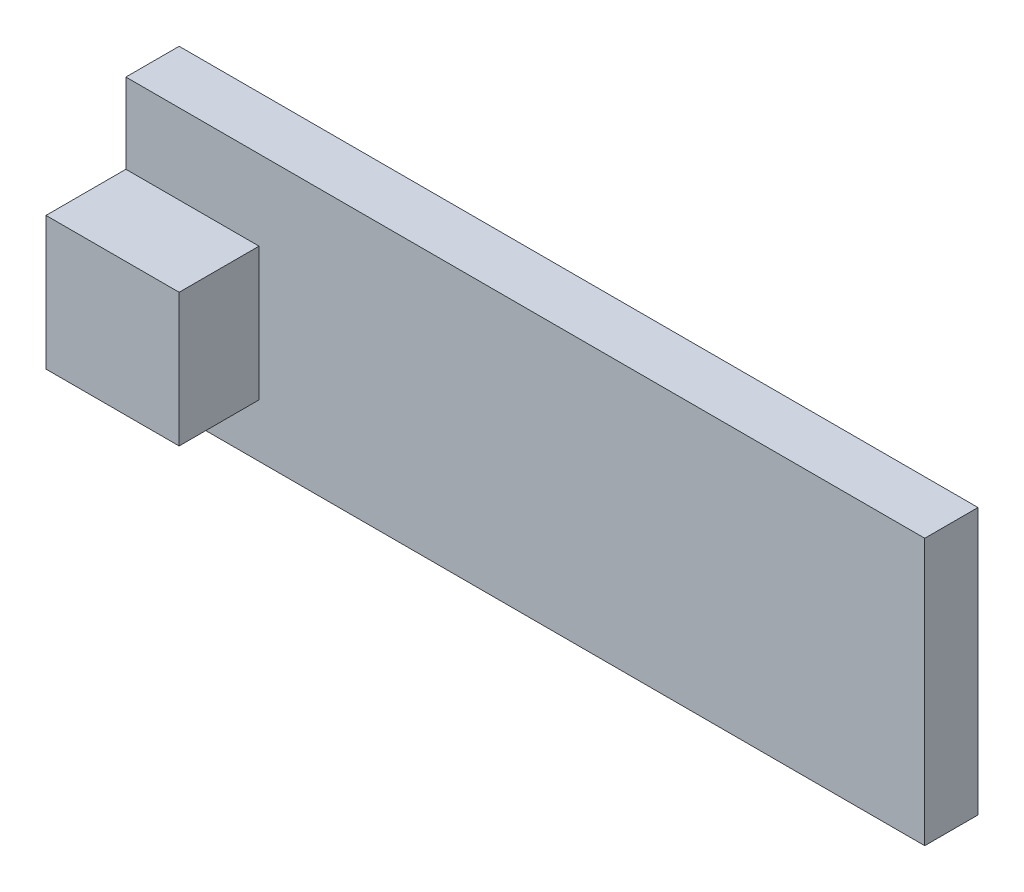
ISO-10303-21;
HEADER;
FILE_DESCRIPTION(('STEP AP214'),'2;1');
FILE_NAME('part.step','',(''),(''),'','','');
FILE_SCHEMA(('AUTOMOTIVE_DESIGN { 1 0 10303 214 1 1 1 1 }'));
ENDSEC;
DATA;
#1=APPLICATION_CONTEXT('core data for automotive mechanical design processes');
#2=APPLICATION_PROTOCOL_DEFINITION('international standard','automotive_design',2000,#1);
#3=PRODUCT_CONTEXT('',#1,'mechanical');
#4=PRODUCT('Part','Part','',(#3));
#5=PRODUCT_RELATED_PRODUCT_CATEGORY('part','',(#4));
#6=PRODUCT_DEFINITION_FORMATION('','',#4);
#7=PRODUCT_DEFINITION_CONTEXT('part definition',#1,'design');
#8=PRODUCT_DEFINITION('design','',#6,#7);
#9=PRODUCT_DEFINITION_SHAPE('','',#8);
#10=(LENGTH_UNIT() NAMED_UNIT(*) SI_UNIT(.MILLI.,.METRE.));
#11=(NAMED_UNIT(*) PLANE_ANGLE_UNIT() SI_UNIT($,.RADIAN.));
#12=(NAMED_UNIT(*) SI_UNIT($,.STERADIAN.) SOLID_ANGLE_UNIT());
#13=UNCERTAINTY_MEASURE_WITH_UNIT(LENGTH_MEASURE(1.E-05),#10,'distance_accuracy_value','');
#14=(GEOMETRIC_REPRESENTATION_CONTEXT(3) GLOBAL_UNCERTAINTY_ASSIGNED_CONTEXT((#13)) GLOBAL_UNIT_ASSIGNED_CONTEXT((#10,
#11,#12)) REPRESENTATION_CONTEXT('',''));
#15=CARTESIAN_POINT('',(0.,0.,0.));
#16=DIRECTION('',(0.,0.,1.));
#17=DIRECTION('',(1.,0.,0.));
#18=AXIS2_PLACEMENT_3D('',#15,#16,#17);
#19=CARTESIAN_POINT('',(4.99999999999999,7.,5.));
#20=DIRECTION('',(-1.,0.,0.));
#21=DIRECTION('',(0.,-1.,0.));
#22=AXIS2_PLACEMENT_3D('',#19,#20,#21);
#23=PLANE('',#22);
#24=DIRECTION('',(0.,1.,0.));
#25=VECTOR('',#24,1.);
#26=CARTESIAN_POINT('',(4.99999999999999,7.,2.));
#27=LINE('',#26,#25);
#28=CARTESIAN_POINT('',(4.99999999999999,2.,2.));
#29=VERTEX_POINT('',#28);
#30=CARTESIAN_POINT('',(4.99999999999999,7.,2.));
#31=VERTEX_POINT('',#30);
#32=EDGE_CURVE('E110',#29,#31,#27,.T.);
#33=ORIENTED_EDGE('',*,*,#32,.T.);
#34=DIRECTION('',(0.,0.,-1.));
#35=VECTOR('',#34,1.);
#36=CARTESIAN_POINT('',(4.99999999999999,7.,5.));
#37=LINE('',#36,#35);
#38=CARTESIAN_POINT('',(4.99999999999999,7.,5.));
#39=VERTEX_POINT('',#38);
#40=EDGE_CURVE('E12',#39,#31,#37,.T.);
#41=ORIENTED_EDGE('',*,*,#40,.F.);
#42=DIRECTION('',(0.,1.,0.));
#43=VECTOR('',#42,1.);
#44=CARTESIAN_POINT('',(4.99999999999999,7.,5.));
#45=LINE('',#44,#43);
#46=CARTESIAN_POINT('',(4.99999999999999,2.,5.));
#47=VERTEX_POINT('',#46);
#48=EDGE_CURVE('E98',#47,#39,#45,.T.);
#49=ORIENTED_EDGE('',*,*,#48,.F.);
#50=DIRECTION('',(0.,0.,-1.));
#51=VECTOR('',#50,1.);
#52=CARTESIAN_POINT('',(4.99999999999999,2.,5.));
#53=LINE('',#52,#51);
#54=EDGE_CURVE('E106',#47,#29,#53,.T.);
#55=ORIENTED_EDGE('',*,*,#54,.T.);
#56=EDGE_LOOP('',(#33,#41,#49,#55));
#57=FACE_BOUND('',#56,.T.);
#58=ADVANCED_FACE('F47',(#57),#23,.F.);
#59=CARTESIAN_POINT('',(4.99999999999999,7.,5.));
#60=DIRECTION('',(0.,-1.,0.));
#61=DIRECTION('',(1.,0.,0.));
#62=AXIS2_PLACEMENT_3D('',#59,#60,#61);
#63=PLANE('',#62);
#64=DIRECTION('',(-1.,0.,0.));
#65=VECTOR('',#64,1.);
#66=CARTESIAN_POINT('',(4.99999999999999,7.,2.));
#67=LINE('',#66,#65);
#68=CARTESIAN_POINT('',(0.,7.,2.));
#69=VERTEX_POINT('',#68);
#70=EDGE_CURVE('E102',#31,#69,#67,.T.);
#71=ORIENTED_EDGE('',*,*,#70,.T.);
#72=DIRECTION('',(0.,0.,-1.));
#73=VECTOR('',#72,1.);
#74=CARTESIAN_POINT('',(0.,7.,5.));
#75=LINE('',#74,#73);
#76=CARTESIAN_POINT('',(0.,7.,5.));
#77=VERTEX_POINT('',#76);
#78=EDGE_CURVE('E55',#77,#69,#75,.T.);
#79=ORIENTED_EDGE('',*,*,#78,.F.);
#80=DIRECTION('',(-1.,0.,0.));
#81=VECTOR('',#80,1.);
#82=CARTESIAN_POINT('',(4.99999999999999,7.,5.));
#83=LINE('',#82,#81);
#84=EDGE_CURVE('E93',#39,#77,#83,.T.);
#85=ORIENTED_EDGE('',*,*,#84,.F.);
#86=ORIENTED_EDGE('',*,*,#40,.T.);
#87=EDGE_LOOP('',(#71,#79,#85,#86));
#88=FACE_BOUND('',#87,.T.);
#89=ADVANCED_FACE('F101',(#88),#63,.F.);
#90=CARTESIAN_POINT('',(0.,7.,5.));
#91=DIRECTION('',(1.,0.,0.));
#92=DIRECTION('',(0.,1.,0.));
#93=AXIS2_PLACEMENT_3D('',#90,#91,#92);
#94=PLANE('',#93);
#95=DIRECTION('',(0.,-1.,0.));
#96=VECTOR('',#95,1.);
#97=CARTESIAN_POINT('',(0.,7.,2.));
#98=LINE('',#97,#96);
#99=CARTESIAN_POINT('',(0.,2.,2.));
#100=VERTEX_POINT('',#99);
#101=EDGE_CURVE('E80',#69,#100,#98,.T.);
#102=ORIENTED_EDGE('',*,*,#101,.T.);
#103=DIRECTION('',(0.,0.,-1.));
#104=VECTOR('',#103,1.);
#105=CARTESIAN_POINT('',(0.,2.,5.));
#106=LINE('',#105,#104);
#107=CARTESIAN_POINT('',(0.,2.,5.));
#108=VERTEX_POINT('',#107);
#109=EDGE_CURVE('E103',#108,#100,#106,.T.);
#110=ORIENTED_EDGE('',*,*,#109,.F.);
#111=DIRECTION('',(0.,-1.,0.));
#112=VECTOR('',#111,1.);
#113=CARTESIAN_POINT('',(0.,7.,5.));
#114=LINE('',#113,#112);
#115=EDGE_CURVE('E96',#77,#108,#114,.T.);
#116=ORIENTED_EDGE('',*,*,#115,.F.);
#117=ORIENTED_EDGE('',*,*,#78,.T.);
#118=EDGE_LOOP('',(#102,#110,#116,#117));
#119=FACE_BOUND('',#118,.T.);
#120=ADVANCED_FACE('F104',(#119),#94,.F.);
#121=CARTESIAN_POINT('',(4.99999999999999,2.,5.));
#122=DIRECTION('',(0.,1.,0.));
#123=DIRECTION('',(-1.,0.,0.));
#124=AXIS2_PLACEMENT_3D('',#121,#122,#123);
#125=PLANE('',#124);
#126=DIRECTION('',(1.,0.,0.));
#127=VECTOR('',#126,1.);
#128=CARTESIAN_POINT('',(4.99999999999999,2.,2.));
#129=LINE('',#128,#127);
#130=EDGE_CURVE('E86',#100,#29,#129,.T.);
#131=ORIENTED_EDGE('',*,*,#130,.T.);
#132=ORIENTED_EDGE('',*,*,#54,.F.);
#133=DIRECTION('',(1.,0.,0.));
#134=VECTOR('',#133,1.);
#135=CARTESIAN_POINT('',(4.99999999999999,2.,5.));
#136=LINE('',#135,#134);
#137=EDGE_CURVE('E63',#108,#47,#136,.T.);
#138=ORIENTED_EDGE('',*,*,#137,.F.);
#139=ORIENTED_EDGE('',*,*,#109,.T.);
#140=EDGE_LOOP('',(#131,#132,#138,#139));
#141=FACE_BOUND('',#140,.T.);
#142=ADVANCED_FACE('F117',(#141),#125,.F.);
#143=CARTESIAN_POINT('',(0.,0.,5.));
#144=DIRECTION('',(0.,0.,-1.));
#145=DIRECTION('',(-1.,0.,0.));
#146=AXIS2_PLACEMENT_3D('',#143,#144,#145);
#147=PLANE('',#146);
#148=ORIENTED_EDGE('',*,*,#48,.T.);
#149=ORIENTED_EDGE('',*,*,#84,.T.);
#150=ORIENTED_EDGE('',*,*,#115,.T.);
#151=ORIENTED_EDGE('',*,*,#137,.T.);
#152=EDGE_LOOP('',(#148,#149,#150,#151));
#153=FACE_BOUND('',#152,.T.);
#154=ADVANCED_FACE('F94',(#153),#147,.F.);
#155=CARTESIAN_POINT('',(0.,0.,2.));
#156=DIRECTION('',(0.,0.,-1.));
#157=DIRECTION('',(-1.,0.,0.));
#158=AXIS2_PLACEMENT_3D('',#155,#156,#157);
#159=PLANE('',#158);
#160=ORIENTED_EDGE('',*,*,#32,.F.);
#161=ORIENTED_EDGE('',*,*,#130,.F.);
#162=ORIENTED_EDGE('',*,*,#101,.F.);
#163=ORIENTED_EDGE('',*,*,#70,.F.);
#164=EDGE_LOOP('',(#160,#161,#162,#163));
#165=FACE_BOUND('',#164,.T.);
#166=ADVANCED_FACE('F120',(#165),#159,.T.);
#167=CLOSED_SHELL('',(#58,#89,#120,#142,#154,#166));
#168=MANIFOLD_SOLID_BREP('B2',#167);
#169=CARTESIAN_POINT('',(0.,0.,2.));
#170=DIRECTION('',(1.,0.,0.));
#171=DIRECTION('',(0.,1.,0.));
#172=AXIS2_PLACEMENT_3D('',#169,#170,#171);
#173=PLANE('',#172);
#174=DIRECTION('',(0.,-1.,0.));
#175=VECTOR('',#174,1.);
#176=CARTESIAN_POINT('',(0.,0.,0.));
#177=LINE('',#176,#175);
#178=CARTESIAN_POINT('',(0.,10.,0.));
#179=VERTEX_POINT('',#178);
#180=CARTESIAN_POINT('',(0.,0.,0.));
#181=VERTEX_POINT('',#180);
#182=EDGE_CURVE('E234',#179,#181,#177,.T.);
#183=ORIENTED_EDGE('',*,*,#182,.T.);
#184=DIRECTION('',(0.,0.,-1.));
#185=VECTOR('',#184,1.);
#186=CARTESIAN_POINT('',(0.,0.,2.));
#187=LINE('',#186,#185);
#188=CARTESIAN_POINT('',(0.,0.,2.));
#189=VERTEX_POINT('',#188);
#190=EDGE_CURVE('E45',#189,#181,#187,.T.);
#191=ORIENTED_EDGE('',*,*,#190,.F.);
#192=DIRECTION('',(0.,-1.,0.));
#193=VECTOR('',#192,1.);
#194=CARTESIAN_POINT('',(0.,0.,2.));
#195=LINE('',#194,#193);
#196=CARTESIAN_POINT('',(0.,10.,2.));
#197=VERTEX_POINT('',#196);
#198=EDGE_CURVE('E222',#197,#189,#195,.T.);
#199=ORIENTED_EDGE('',*,*,#198,.F.);
#200=DIRECTION('',(0.,0.,-1.));
#201=VECTOR('',#200,1.);
#202=CARTESIAN_POINT('',(0.,10.,2.));
#203=LINE('',#202,#201);
#204=EDGE_CURVE('E230',#197,#179,#203,.T.);
#205=ORIENTED_EDGE('',*,*,#204,.T.);
#206=EDGE_LOOP('',(#183,#191,#199,#205));
#207=FACE_BOUND('',#206,.T.);
#208=ADVANCED_FACE('F171',(#207),#173,.F.);
#209=CARTESIAN_POINT('',(0.,0.,2.));
#210=DIRECTION('',(0.,1.,0.));
#211=DIRECTION('',(0.,0.,1.));
#212=AXIS2_PLACEMENT_3D('',#209,#210,#211);
#213=PLANE('',#212);
#214=DIRECTION('',(1.,0.,0.));
#215=VECTOR('',#214,1.);
#216=CARTESIAN_POINT('',(0.,0.,0.));
#217=LINE('',#216,#215);
#218=CARTESIAN_POINT('',(30.,0.,0.));
#219=VERTEX_POINT('',#218);
#220=EDGE_CURVE('E226',#181,#219,#217,.T.);
#221=ORIENTED_EDGE('',*,*,#220,.T.);
#222=DIRECTION('',(0.,0.,-1.));
#223=VECTOR('',#222,1.);
#224=CARTESIAN_POINT('',(30.,0.,2.));
#225=LINE('',#224,#223);
#226=CARTESIAN_POINT('',(30.,0.,2.));
#227=VERTEX_POINT('',#226);
#228=EDGE_CURVE('E179',#227,#219,#225,.T.);
#229=ORIENTED_EDGE('',*,*,#228,.F.);
#230=DIRECTION('',(1.,0.,0.));
#231=VECTOR('',#230,1.);
#232=CARTESIAN_POINT('',(0.,0.,2.));
#233=LINE('',#232,#231);
#234=EDGE_CURVE('E217',#189,#227,#233,.T.);
#235=ORIENTED_EDGE('',*,*,#234,.F.);
#236=ORIENTED_EDGE('',*,*,#190,.T.);
#237=EDGE_LOOP('',(#221,#229,#235,#236));
#238=FACE_BOUND('',#237,.T.);
#239=ADVANCED_FACE('F225',(#238),#213,.F.);
#240=CARTESIAN_POINT('',(30.,0.,2.));
#241=DIRECTION('',(-1.,0.,0.));
#242=DIRECTION('',(0.,-1.,0.));
#243=AXIS2_PLACEMENT_3D('',#240,#241,#242);
#244=PLANE('',#243);
#245=DIRECTION('',(0.,1.,0.));
#246=VECTOR('',#245,1.);
#247=CARTESIAN_POINT('',(30.,0.,0.));
#248=LINE('',#247,#246);
#249=CARTESIAN_POINT('',(30.,10.,0.));
#250=VERTEX_POINT('',#249);
#251=EDGE_CURVE('E204',#219,#250,#248,.T.);
#252=ORIENTED_EDGE('',*,*,#251,.T.);
#253=DIRECTION('',(0.,0.,-1.));
#254=VECTOR('',#253,1.);
#255=CARTESIAN_POINT('',(30.,10.,2.));
#256=LINE('',#255,#254);
#257=CARTESIAN_POINT('',(30.,10.,2.));
#258=VERTEX_POINT('',#257);
#259=EDGE_CURVE('E227',#258,#250,#256,.T.);
#260=ORIENTED_EDGE('',*,*,#259,.F.);
#261=DIRECTION('',(0.,1.,0.));
#262=VECTOR('',#261,1.);
#263=CARTESIAN_POINT('',(30.,0.,2.));
#264=LINE('',#263,#262);
#265=EDGE_CURVE('E220',#227,#258,#264,.T.);
#266=ORIENTED_EDGE('',*,*,#265,.F.);
#267=ORIENTED_EDGE('',*,*,#228,.T.);
#268=EDGE_LOOP('',(#252,#260,#266,#267));
#269=FACE_BOUND('',#268,.T.);
#270=ADVANCED_FACE('F228',(#269),#244,.F.);
#271=CARTESIAN_POINT('',(0.,10.,2.));
#272=DIRECTION('',(0.,-1.,0.));
#273=DIRECTION('',(0.,0.,-1.));
#274=AXIS2_PLACEMENT_3D('',#271,#272,#273);
#275=PLANE('',#274);
#276=DIRECTION('',(-1.,0.,0.));
#277=VECTOR('',#276,1.);
#278=CARTESIAN_POINT('',(0.,10.,0.));
#279=LINE('',#278,#277);
#280=EDGE_CURVE('E210',#250,#179,#279,.T.);
#281=ORIENTED_EDGE('',*,*,#280,.T.);
#282=ORIENTED_EDGE('',*,*,#204,.F.);
#283=DIRECTION('',(-1.,0.,0.));
#284=VECTOR('',#283,1.);
#285=CARTESIAN_POINT('',(0.,10.,2.));
#286=LINE('',#285,#284);
#287=EDGE_CURVE('E187',#258,#197,#286,.T.);
#288=ORIENTED_EDGE('',*,*,#287,.F.);
#289=ORIENTED_EDGE('',*,*,#259,.T.);
#290=EDGE_LOOP('',(#281,#282,#288,#289));
#291=FACE_BOUND('',#290,.T.);
#292=ADVANCED_FACE('F241',(#291),#275,.F.);
#293=CARTESIAN_POINT('',(0.,0.,2.));
#294=DIRECTION('',(0.,0.,-1.));
#295=DIRECTION('',(-1.,0.,0.));
#296=AXIS2_PLACEMENT_3D('',#293,#294,#295);
#297=PLANE('',#296);
#298=ORIENTED_EDGE('',*,*,#198,.T.);
#299=ORIENTED_EDGE('',*,*,#234,.T.);
#300=ORIENTED_EDGE('',*,*,#265,.T.);
#301=ORIENTED_EDGE('',*,*,#287,.T.);
#302=EDGE_LOOP('',(#298,#299,#300,#301));
#303=FACE_BOUND('',#302,.T.);
#304=ADVANCED_FACE('F218',(#303),#297,.F.);
#305=CARTESIAN_POINT('',(0.,0.,0.));
#306=DIRECTION('',(0.,0.,-1.));
#307=DIRECTION('',(-1.,0.,0.));
#308=AXIS2_PLACEMENT_3D('',#305,#306,#307);
#309=PLANE('',#308);
#310=ORIENTED_EDGE('',*,*,#182,.F.);
#311=ORIENTED_EDGE('',*,*,#280,.F.);
#312=ORIENTED_EDGE('',*,*,#251,.F.);
#313=ORIENTED_EDGE('',*,*,#220,.F.);
#314=EDGE_LOOP('',(#310,#311,#312,#313));
#315=FACE_BOUND('',#314,.T.);
#316=ADVANCED_FACE('F244',(#315),#309,.T.);
#317=CLOSED_SHELL('',(#208,#239,#270,#292,#304,#316));
#318=MANIFOLD_SOLID_BREP('B6',#317);
#319=ADVANCED_BREP_SHAPE_REPRESENTATION('',(#18,#168,#318),#14);
#320=SHAPE_DEFINITION_REPRESENTATION(#9,#319);
ENDSEC;
END-ISO-10303-21;
